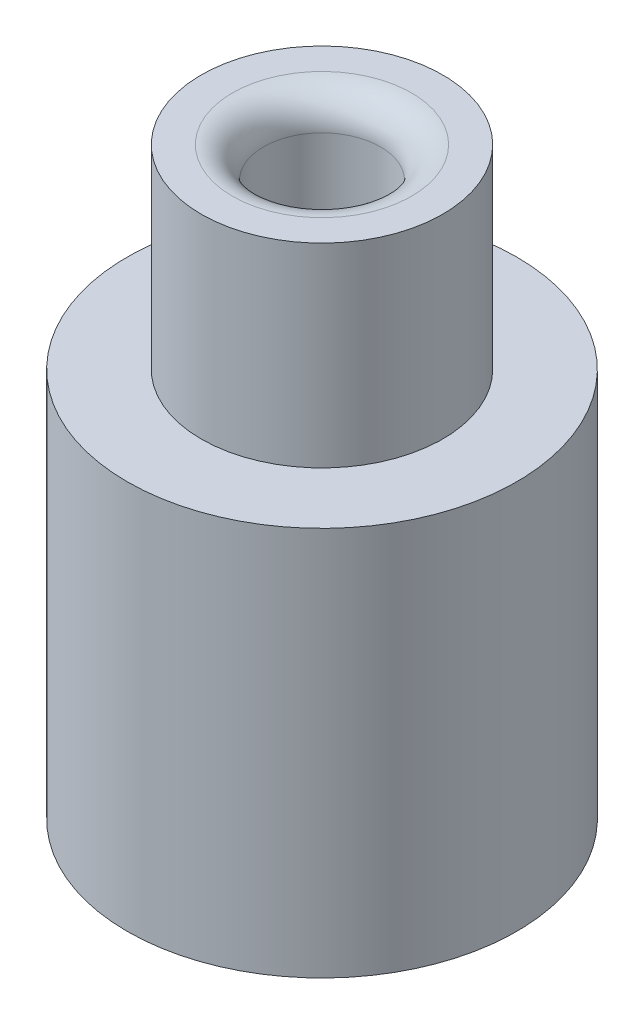
ISO-10303-21;
HEADER;
FILE_DESCRIPTION(('STEP AP214'),'2;1');
FILE_NAME('part.step','',(''),(''),'','','');
FILE_SCHEMA(('AUTOMOTIVE_DESIGN { 1 0 10303 214 1 1 1 1 }'));
ENDSEC;
DATA;
#1=APPLICATION_CONTEXT('core data for automotive mechanical design processes');
#2=APPLICATION_PROTOCOL_DEFINITION('international standard','automotive_design',2000,#1);
#3=PRODUCT_CONTEXT('',#1,'mechanical');
#4=PRODUCT('Part','Part','',(#3));
#5=PRODUCT_RELATED_PRODUCT_CATEGORY('part','',(#4));
#6=PRODUCT_DEFINITION_FORMATION('','',#4);
#7=PRODUCT_DEFINITION_CONTEXT('part definition',#1,'design');
#8=PRODUCT_DEFINITION('design','',#6,#7);
#9=PRODUCT_DEFINITION_SHAPE('','',#8);
#10=(LENGTH_UNIT() NAMED_UNIT(*) SI_UNIT(.MILLI.,.METRE.));
#11=(NAMED_UNIT(*) PLANE_ANGLE_UNIT() SI_UNIT($,.RADIAN.));
#12=(NAMED_UNIT(*) SI_UNIT($,.STERADIAN.) SOLID_ANGLE_UNIT());
#13=UNCERTAINTY_MEASURE_WITH_UNIT(LENGTH_MEASURE(1.E-05),#10,'distance_accuracy_value','');
#14=(GEOMETRIC_REPRESENTATION_CONTEXT(3) GLOBAL_UNCERTAINTY_ASSIGNED_CONTEXT((#13)) GLOBAL_UNIT_ASSIGNED_CONTEXT((#10,
#11,#12)) REPRESENTATION_CONTEXT('',''));
#15=CARTESIAN_POINT('',(0.,0.,0.));
#16=DIRECTION('',(0.,0.,1.));
#17=DIRECTION('',(1.,0.,0.));
#18=AXIS2_PLACEMENT_3D('',#15,#16,#17);
#19=CARTESIAN_POINT('',(0.,-4.,0.));
#20=DIRECTION('',(0.,1.,0.));
#21=DIRECTION('',(0.,0.,1.));
#22=AXIS2_PLACEMENT_3D('',#19,#20,#21);
#23=CYLINDRICAL_SURFACE('',#22,5.);
#24=CARTESIAN_POINT('',(0.,-4.,0.));
#25=DIRECTION('',(0.,1.,0.));
#26=DIRECTION('',(0.,0.,1.));
#27=AXIS2_PLACEMENT_3D('',#24,#25,#26);
#28=CIRCLE('',#27,5.);
#29=CARTESIAN_POINT('',(0.,-4.,5.));
#30=VERTEX_POINT('',#29);
#31=EDGE_CURVE('E46',#30,#30,#28,.T.);
#32=ORIENTED_EDGE('',*,*,#31,.T.);
#33=EDGE_LOOP('',(#32));
#34=FACE_BOUND('',#33,.T.);
#35=CARTESIAN_POINT('',(0.,6.,0.));
#36=DIRECTION('',(0.,1.,0.));
#37=DIRECTION('',(0.,0.,1.));
#38=AXIS2_PLACEMENT_3D('',#35,#36,#37);
#39=CIRCLE('',#38,5.);
#40=CARTESIAN_POINT('',(0.,6.,5.));
#41=VERTEX_POINT('',#40);
#42=EDGE_CURVE('E51',#41,#41,#39,.T.);
#43=ORIENTED_EDGE('',*,*,#42,.F.);
#44=EDGE_LOOP('',(#43));
#45=FACE_BOUND('',#44,.T.);
#46=ADVANCED_FACE('F31',(#34,#45),#23,.T.);
#47=CARTESIAN_POINT('',(0.,-4.,0.));
#48=DIRECTION('',(0.,1.,0.));
#49=DIRECTION('',(0.,0.,1.));
#50=AXIS2_PLACEMENT_3D('',#47,#48,#49);
#51=PLANE('',#50);
#52=CARTESIAN_POINT('',(0.,-4.,0.));
#53=DIRECTION('',(0.,-1.,0.));
#54=DIRECTION('',(0.,0.,-1.));
#55=AXIS2_PLACEMENT_3D('',#52,#53,#54);
#56=CIRCLE('',#55,2.25);
#57=CARTESIAN_POINT('',(0.,-4.,-2.25));
#58=VERTEX_POINT('',#57);
#59=EDGE_CURVE('E61',#58,#58,#56,.T.);
#60=ORIENTED_EDGE('',*,*,#59,.F.);
#61=EDGE_LOOP('',(#60));
#62=FACE_BOUND('',#61,.T.);
#63=ORIENTED_EDGE('',*,*,#31,.F.);
#64=EDGE_LOOP('',(#63));
#65=FACE_BOUND('',#64,.T.);
#66=ADVANCED_FACE('F76',(#62,#65),#51,.F.);
#67=CARTESIAN_POINT('',(0.,6.,0.));
#68=DIRECTION('',(0.,1.,0.));
#69=DIRECTION('',(0.,0.,1.));
#70=AXIS2_PLACEMENT_3D('',#67,#68,#69);
#71=PLANE('',#70);
#72=CARTESIAN_POINT('',(0.,6.,0.));
#73=DIRECTION('',(0.,1.,0.));
#74=DIRECTION('',(0.,0.,1.));
#75=AXIS2_PLACEMENT_3D('',#72,#73,#74);
#76=CIRCLE('',#75,3.1);
#77=CARTESIAN_POINT('',(0.,6.,3.1));
#78=VERTEX_POINT('',#77);
#79=EDGE_CURVE('E42',#78,#78,#76,.T.);
#80=ORIENTED_EDGE('',*,*,#79,.F.);
#81=EDGE_LOOP('',(#80));
#82=FACE_BOUND('',#81,.T.);
#83=ORIENTED_EDGE('',*,*,#42,.T.);
#84=EDGE_LOOP('',(#83));
#85=FACE_BOUND('',#84,.T.);
#86=ADVANCED_FACE('F79',(#82,#85),#71,.T.);
#87=CARTESIAN_POINT('',(0.,5.,0.));
#88=DIRECTION('',(0.,1.,0.));
#89=DIRECTION('',(0.,0.,1.));
#90=AXIS2_PLACEMENT_3D('',#87,#88,#89);
#91=CYLINDRICAL_SURFACE('',#90,3.1);
#92=ORIENTED_EDGE('',*,*,#79,.T.);
#93=EDGE_LOOP('',(#92));
#94=FACE_BOUND('',#93,.T.);
#95=CARTESIAN_POINT('',(0.,11.,0.));
#96=DIRECTION('',(0.,1.,0.));
#97=DIRECTION('',(0.,0.,1.));
#98=AXIS2_PLACEMENT_3D('',#95,#96,#97);
#99=CIRCLE('',#98,3.1);
#100=CARTESIAN_POINT('',(0.,11.,3.1));
#101=VERTEX_POINT('',#100);
#102=EDGE_CURVE('E54',#101,#101,#99,.T.);
#103=ORIENTED_EDGE('',*,*,#102,.F.);
#104=EDGE_LOOP('',(#103));
#105=FACE_BOUND('',#104,.T.);
#106=ADVANCED_FACE('F88',(#94,#105),#91,.T.);
#107=CARTESIAN_POINT('',(0.,11.,0.));
#108=DIRECTION('',(0.,1.,0.));
#109=DIRECTION('',(0.,0.,1.));
#110=AXIS2_PLACEMENT_3D('',#107,#108,#109);
#111=PLANE('',#110);
#112=CARTESIAN_POINT('',(0.,11.,0.));
#113=DIRECTION('',(0.,1.,0.));
#114=DIRECTION('',(0.,0.,1.));
#115=AXIS2_PLACEMENT_3D('',#112,#113,#114);
#116=CIRCLE('',#115,2.3);
#117=CARTESIAN_POINT('',(0.,11.,2.3));
#118=VERTEX_POINT('',#117);
#119=EDGE_CURVE('E10',#118,#118,#116,.F.);
#120=ORIENTED_EDGE('',*,*,#119,.T.);
#121=EDGE_LOOP('',(#120));
#122=FACE_BOUND('',#121,.T.);
#123=ORIENTED_EDGE('',*,*,#102,.T.);
#124=EDGE_LOOP('',(#123));
#125=FACE_BOUND('',#124,.T.);
#126=ADVANCED_FACE('F94',(#122,#125),#111,.T.);
#127=CARTESIAN_POINT('',(0.,0.999999999999999,0.));
#128=DIRECTION('',(0.,1.,0.));
#129=DIRECTION('',(0.,0.,1.));
#130=AXIS2_PLACEMENT_3D('',#127,#128,#129);
#131=CYLINDRICAL_SURFACE('',#130,1.5);
#132=CARTESIAN_POINT('',(0.,10.2,0.));
#133=DIRECTION('',(0.,1.,0.));
#134=DIRECTION('',(0.,0.,1.));
#135=AXIS2_PLACEMENT_3D('',#132,#133,#134);
#136=CIRCLE('',#135,1.5);
#137=CARTESIAN_POINT('',(0.,10.2,1.5));
#138=VERTEX_POINT('',#137);
#139=EDGE_CURVE('E38',#138,#138,#136,.T.);
#140=ORIENTED_EDGE('',*,*,#139,.T.);
#141=EDGE_LOOP('',(#140));
#142=FACE_BOUND('',#141,.T.);
#143=CARTESIAN_POINT('',(0.,1.,0.));
#144=DIRECTION('',(0.,-1.,0.));
#145=DIRECTION('',(0.,0.,-1.));
#146=AXIS2_PLACEMENT_3D('',#143,#144,#145);
#147=CIRCLE('',#146,1.5);
#148=CARTESIAN_POINT('',(0.,1.,-1.5));
#149=VERTEX_POINT('',#148);
#150=EDGE_CURVE('E57',#149,#149,#147,.F.);
#151=ORIENTED_EDGE('',*,*,#150,.F.);
#152=EDGE_LOOP('',(#151));
#153=FACE_BOUND('',#152,.T.);
#154=ADVANCED_FACE('F101',(#142,#153),#131,.F.);
#155=CARTESIAN_POINT('',(0.,1.,0.));
#156=DIRECTION('',(0.,-1.,0.));
#157=DIRECTION('',(0.,0.,-1.));
#158=AXIS2_PLACEMENT_3D('',#155,#156,#157);
#159=PLANE('',#158);
#160=CARTESIAN_POINT('',(0.,1.,0.));
#161=DIRECTION('',(0.,-1.,0.));
#162=DIRECTION('',(0.,0.,-1.));
#163=AXIS2_PLACEMENT_3D('',#160,#161,#162);
#164=CIRCLE('',#163,2.25);
#165=CARTESIAN_POINT('',(0.,1.,-2.25));
#166=VERTEX_POINT('',#165);
#167=EDGE_CURVE('E60',#166,#166,#164,.T.);
#168=ORIENTED_EDGE('',*,*,#167,.T.);
#169=EDGE_LOOP('',(#168));
#170=FACE_BOUND('',#169,.T.);
#171=ORIENTED_EDGE('',*,*,#150,.T.);
#172=EDGE_LOOP('',(#171));
#173=FACE_BOUND('',#172,.T.);
#174=ADVANCED_FACE('F67',(#170,#173),#159,.T.);
#175=CARTESIAN_POINT('',(0.,1.,0.));
#176=DIRECTION('',(0.,-1.,0.));
#177=DIRECTION('',(0.,0.,-1.));
#178=AXIS2_PLACEMENT_3D('',#175,#176,#177);
#179=CYLINDRICAL_SURFACE('',#178,2.25);
#180=ORIENTED_EDGE('',*,*,#167,.F.);
#181=EDGE_LOOP('',(#180));
#182=FACE_BOUND('',#181,.T.);
#183=ORIENTED_EDGE('',*,*,#59,.T.);
#184=EDGE_LOOP('',(#183));
#185=FACE_BOUND('',#184,.T.);
#186=ADVANCED_FACE('F70',(#182,#185),#179,.F.);
#187=CARTESIAN_POINT('',(0.,10.2,0.));
#188=DIRECTION('',(0.,1.,0.));
#189=DIRECTION('',(0.,0.,1.));
#190=AXIS2_PLACEMENT_3D('',#187,#188,#189);
#191=TOROIDAL_SURFACE('',#190,2.3,0.8);
#192=ORIENTED_EDGE('',*,*,#119,.F.);
#193=EDGE_LOOP('',(#192));
#194=FACE_BOUND('',#193,.T.);
#195=ORIENTED_EDGE('',*,*,#139,.F.);
#196=EDGE_LOOP('',(#195));
#197=FACE_BOUND('',#196,.T.);
#198=ADVANCED_FACE('F33',(#194,#197),#191,.T.);
#199=CLOSED_SHELL('',(#46,#66,#86,#106,#126,#154,#174,#186,#198));
#200=MANIFOLD_SOLID_BREP('B2',#199);
#201=ADVANCED_BREP_SHAPE_REPRESENTATION('',(#18,#200),#14);
#202=SHAPE_DEFINITION_REPRESENTATION(#9,#201);
ENDSEC;
END-ISO-10303-21;
